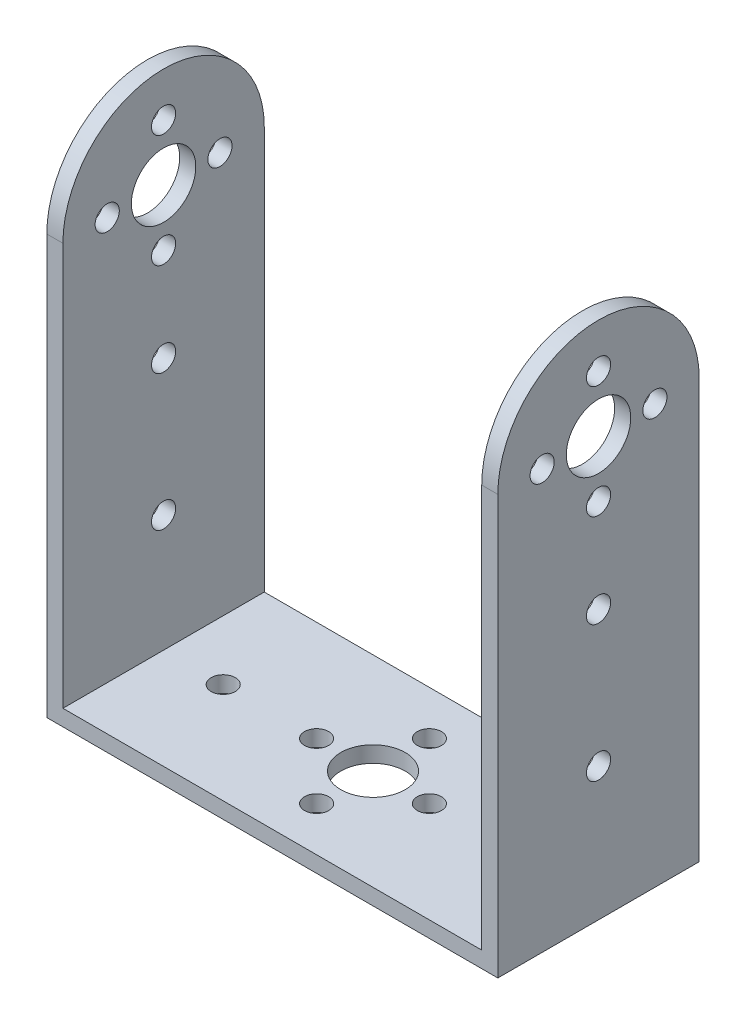
ISO-10303-21;
HEADER;
FILE_DESCRIPTION(('STEP AP214'),'2;1');
FILE_NAME('part.step','',(''),(''),'','','');
FILE_SCHEMA(('AUTOMOTIVE_DESIGN { 1 0 10303 214 1 1 1 1 }'));
ENDSEC;
DATA;
#1=APPLICATION_CONTEXT('core data for automotive mechanical design processes');
#2=APPLICATION_PROTOCOL_DEFINITION('international standard','automotive_design',2000,#1);
#3=PRODUCT_CONTEXT('',#1,'mechanical');
#4=PRODUCT('Part','Part','',(#3));
#5=PRODUCT_RELATED_PRODUCT_CATEGORY('part','',(#4));
#6=PRODUCT_DEFINITION_FORMATION('','',#4);
#7=PRODUCT_DEFINITION_CONTEXT('part definition',#1,'design');
#8=PRODUCT_DEFINITION('design','',#6,#7);
#9=PRODUCT_DEFINITION_SHAPE('','',#8);
#10=(LENGTH_UNIT() NAMED_UNIT(*) SI_UNIT(.MILLI.,.METRE.));
#11=(NAMED_UNIT(*) PLANE_ANGLE_UNIT() SI_UNIT($,.RADIAN.));
#12=(NAMED_UNIT(*) SI_UNIT($,.STERADIAN.) SOLID_ANGLE_UNIT());
#13=UNCERTAINTY_MEASURE_WITH_UNIT(LENGTH_MEASURE(1.E-05),#10,'distance_accuracy_value','');
#14=(GEOMETRIC_REPRESENTATION_CONTEXT(3) GLOBAL_UNCERTAINTY_ASSIGNED_CONTEXT((#13)) GLOBAL_UNIT_ASSIGNED_CONTEXT((#10,
#11,#12)) REPRESENTATION_CONTEXT('',''));
#15=CARTESIAN_POINT('',(0.,0.,0.));
#16=DIRECTION('',(0.,0.,1.));
#17=DIRECTION('',(1.,0.,0.));
#18=AXIS2_PLACEMENT_3D('',#15,#16,#17);
#19=CARTESIAN_POINT('',(0.,2.,0.));
#20=DIRECTION('',(0.,1.,0.));
#21=DIRECTION('',(0.,0.,1.));
#22=AXIS2_PLACEMENT_3D('',#19,#20,#21);
#23=PLANE('',#22);
#24=CARTESIAN_POINT('',(26.2542553191489,2.,-0.73138297872341));
#25=DIRECTION('',(0.,1.,0.));
#26=DIRECTION('',(0.,0.,1.));
#27=AXIS2_PLACEMENT_3D('',#24,#25,#26);
#28=CIRCLE('',#27,1.5);
#29=CARTESIAN_POINT('',(26.2542553191489,2.,0.768617021276591));
#30=VERTEX_POINT('',#29);
#31=EDGE_CURVE('E194',#30,#30,#28,.T.);
#32=ORIENTED_EDGE('',*,*,#31,.F.);
#33=EDGE_LOOP('',(#32));
#34=FACE_BOUND('',#33,.T.);
#35=CARTESIAN_POINT('',(0.654255319149036,2.,-0.731382978723379));
#36=DIRECTION('',(0.,1.,0.));
#37=DIRECTION('',(0.,0.,1.));
#38=AXIS2_PLACEMENT_3D('',#35,#36,#37);
#39=CIRCLE('',#38,1.5);
#40=CARTESIAN_POINT('',(0.654255319149036,2.,0.768617021276619));
#41=VERTEX_POINT('',#40);
#42=EDGE_CURVE('E207',#41,#41,#39,.T.);
#43=ORIENTED_EDGE('',*,*,#42,.F.);
#44=EDGE_LOOP('',(#43));
#45=FACE_BOUND('',#44,.T.);
#46=CARTESIAN_POINT('',(7.65425531914909,2.,6.2686170212766));
#47=DIRECTION('',(0.,1.,0.));
#48=DIRECTION('',(0.,0.,1.));
#49=AXIS2_PLACEMENT_3D('',#46,#47,#48);
#50=CIRCLE('',#49,1.5);
#51=CARTESIAN_POINT('',(7.65425531914909,2.,7.7686170212766));
#52=VERTEX_POINT('',#51);
#53=EDGE_CURVE('E201',#52,#52,#50,.T.);
#54=ORIENTED_EDGE('',*,*,#53,.F.);
#55=EDGE_LOOP('',(#54));
#56=FACE_BOUND('',#55,.T.);
#57=CARTESIAN_POINT('',(14.654255319149,2.,-0.731382978723479));
#58=DIRECTION('',(0.,1.,0.));
#59=DIRECTION('',(0.,0.,1.));
#60=AXIS2_PLACEMENT_3D('',#57,#58,#59);
#61=CIRCLE('',#60,1.5);
#62=CARTESIAN_POINT('',(14.654255319149,2.,0.768617021276519));
#63=VERTEX_POINT('',#62);
#64=EDGE_CURVE('E200',#63,#63,#61,.T.);
#65=ORIENTED_EDGE('',*,*,#64,.F.);
#66=EDGE_LOOP('',(#65));
#67=FACE_BOUND('',#66,.T.);
#68=CARTESIAN_POINT('',(-10.9457446808511,2.,-0.731382978723405));
#69=DIRECTION('',(0.,1.,0.));
#70=DIRECTION('',(0.,0.,1.));
#71=AXIS2_PLACEMENT_3D('',#68,#69,#70);
#72=CIRCLE('',#71,1.5);
#73=CARTESIAN_POINT('',(-10.9457446808511,2.,0.768617021276595));
#74=VERTEX_POINT('',#73);
#75=EDGE_CURVE('E225',#74,#74,#72,.T.);
#76=ORIENTED_EDGE('',*,*,#75,.F.);
#77=EDGE_LOOP('',(#76));
#78=FACE_BOUND('',#77,.T.);
#79=CARTESIAN_POINT('',(7.65425531914894,2.,-7.73138297872341));
#80=DIRECTION('',(0.,1.,0.));
#81=DIRECTION('',(0.,0.,1.));
#82=AXIS2_PLACEMENT_3D('',#79,#80,#81);
#83=CIRCLE('',#82,1.5);
#84=CARTESIAN_POINT('',(7.65425531914894,2.,-6.23138297872341));
#85=VERTEX_POINT('',#84);
#86=EDGE_CURVE('E219',#85,#85,#83,.T.);
#87=ORIENTED_EDGE('',*,*,#86,.F.);
#88=EDGE_LOOP('',(#87));
#89=FACE_BOUND('',#88,.T.);
#90=CARTESIAN_POINT('',(7.65425531914894,2.,-0.731382978723405));
#91=DIRECTION('',(0.,1.,0.));
#92=DIRECTION('',(0.,0.,1.));
#93=AXIS2_PLACEMENT_3D('',#90,#91,#92);
#94=CIRCLE('',#93,4.);
#95=CARTESIAN_POINT('',(7.65425531914894,2.,3.2686170212766));
#96=VERTEX_POINT('',#95);
#97=EDGE_CURVE('E218',#96,#96,#94,.T.);
#98=ORIENTED_EDGE('',*,*,#97,.F.);
#99=EDGE_LOOP('',(#98));
#100=FACE_BOUND('',#99,.T.);
#101=DIRECTION('',(1.,0.,0.));
#102=VECTOR('',#101,1.);
#103=CARTESIAN_POINT('',(-20.3457446808511,2.,11.7686170212766));
#104=LINE('',#103,#102);
#105=CARTESIAN_POINT('',(-18.3457446808511,2.,11.7686170212766));
#106=VERTEX_POINT('',#105);
#107=CARTESIAN_POINT('',(33.6542553191489,2.,11.7686170212766));
#108=VERTEX_POINT('',#107);
#109=EDGE_CURVE('E50',#106,#108,#104,.T.);
#110=ORIENTED_EDGE('',*,*,#109,.T.);
#111=DIRECTION('',(0.,0.,1.));
#112=VECTOR('',#111,1.);
#113=CARTESIAN_POINT('',(33.6542553191489,2.,-13.2313829787234));
#114=LINE('',#113,#112);
#115=CARTESIAN_POINT('',(33.6542553191489,2.,-13.2313829787234));
#116=VERTEX_POINT('',#115);
#117=EDGE_CURVE('E122',#116,#108,#114,.T.);
#118=ORIENTED_EDGE('',*,*,#117,.F.);
#119=DIRECTION('',(-1.,0.,0.));
#120=VECTOR('',#119,1.);
#121=CARTESIAN_POINT('',(-20.3457446808511,2.,-13.2313829787234));
#122=LINE('',#121,#120);
#123=CARTESIAN_POINT('',(-18.3457446808511,2.,-13.2313829787234));
#124=VERTEX_POINT('',#123);
#125=EDGE_CURVE('E126',#116,#124,#122,.T.);
#126=ORIENTED_EDGE('',*,*,#125,.T.);
#127=DIRECTION('',(0.,0.,1.));
#128=VECTOR('',#127,1.);
#129=CARTESIAN_POINT('',(-18.3457446808511,2.,-13.2313829787234));
#130=LINE('',#129,#128);
#131=EDGE_CURVE('E182',#124,#106,#130,.T.);
#132=ORIENTED_EDGE('',*,*,#131,.T.);
#133=EDGE_LOOP('',(#110,#118,#126,#132));
#134=FACE_BOUND('',#133,.T.);
#135=ADVANCED_FACE('F35',(#34,#45,#56,#67,#78,#89,#100,#134),#23,.T.);
#136=CARTESIAN_POINT('',(-20.3457446808511,2.,-13.2313829787234));
#137=DIRECTION('',(1.,0.,0.));
#138=DIRECTION('',(0.,0.,-1.));
#139=AXIS2_PLACEMENT_3D('',#136,#137,#138);
#140=PLANE('',#139);
#141=CARTESIAN_POINT('',(-20.3457446808511,45.,-0.731382978723404));
#142=DIRECTION('',(-1.,0.,0.));
#143=DIRECTION('',(0.,0.,1.));
#144=AXIS2_PLACEMENT_3D('',#141,#142,#143);
#145=CIRCLE('',#144,1.5);
#146=CARTESIAN_POINT('',(-20.3457446808511,45.,0.768617021276594));
#147=VERTEX_POINT('',#146);
#148=EDGE_CURVE('E145',#147,#147,#145,.T.);
#149=ORIENTED_EDGE('',*,*,#148,.F.);
#150=EDGE_LOOP('',(#149));
#151=FACE_BOUND('',#150,.T.);
#152=CARTESIAN_POINT('',(-20.3457446808511,52.,-7.7313829787234));
#153=DIRECTION('',(-1.,0.,0.));
#154=DIRECTION('',(0.,0.,1.));
#155=AXIS2_PLACEMENT_3D('',#152,#153,#154);
#156=CIRCLE('',#155,1.5);
#157=CARTESIAN_POINT('',(-20.3457446808511,52.,-6.2313829787234));
#158=VERTEX_POINT('',#157);
#159=EDGE_CURVE('E138',#158,#158,#156,.T.);
#160=ORIENTED_EDGE('',*,*,#159,.F.);
#161=EDGE_LOOP('',(#160));
#162=FACE_BOUND('',#161,.T.);
#163=CARTESIAN_POINT('',(-20.3457446808511,16.53,-0.731382978723405));
#164=DIRECTION('',(-1.,0.,0.));
#165=DIRECTION('',(0.,0.,1.));
#166=AXIS2_PLACEMENT_3D('',#163,#164,#165);
#167=CIRCLE('',#166,1.5);
#168=CARTESIAN_POINT('',(-20.3457446808511,16.53,0.768617021276596));
#169=VERTEX_POINT('',#168);
#170=EDGE_CURVE('E136',#169,#169,#167,.T.);
#171=ORIENTED_EDGE('',*,*,#170,.F.);
#172=EDGE_LOOP('',(#171));
#173=FACE_BOUND('',#172,.T.);
#174=CARTESIAN_POINT('',(-20.3457446808511,52.,-0.731382978723405));
#175=DIRECTION('',(-1.,0.,0.));
#176=DIRECTION('',(0.,0.,1.));
#177=AXIS2_PLACEMENT_3D('',#174,#175,#176);
#178=CIRCLE('',#177,4.);
#179=CARTESIAN_POINT('',(-20.3457446808511,52.,3.2686170212766));
#180=VERTEX_POINT('',#179);
#181=EDGE_CURVE('E163',#180,#180,#178,.T.);
#182=ORIENTED_EDGE('',*,*,#181,.F.);
#183=EDGE_LOOP('',(#182));
#184=FACE_BOUND('',#183,.T.);
#185=CARTESIAN_POINT('',(-20.3457446808511,59.,-0.731382978723405));
#186=DIRECTION('',(-1.,0.,0.));
#187=DIRECTION('',(0.,0.,1.));
#188=AXIS2_PLACEMENT_3D('',#185,#186,#187);
#189=CIRCLE('',#188,1.5);
#190=CARTESIAN_POINT('',(-20.3457446808511,59.,0.768617021276596));
#191=VERTEX_POINT('',#190);
#192=EDGE_CURVE('E156',#191,#191,#189,.T.);
#193=ORIENTED_EDGE('',*,*,#192,.F.);
#194=EDGE_LOOP('',(#193));
#195=FACE_BOUND('',#194,.T.);
#196=CARTESIAN_POINT('',(-20.3457446808511,52.,6.26861702127659));
#197=DIRECTION('',(-1.,0.,0.));
#198=DIRECTION('',(0.,0.,1.));
#199=AXIS2_PLACEMENT_3D('',#196,#197,#198);
#200=CIRCLE('',#199,1.5);
#201=CARTESIAN_POINT('',(-20.3457446808511,52.,7.7686170212766));
#202=VERTEX_POINT('',#201);
#203=EDGE_CURVE('E155',#202,#202,#200,.T.);
#204=ORIENTED_EDGE('',*,*,#203,.F.);
#205=EDGE_LOOP('',(#204));
#206=FACE_BOUND('',#205,.T.);
#207=CARTESIAN_POINT('',(-20.3457446808511,33.4,-0.731382978723405));
#208=DIRECTION('',(-1.,0.,0.));
#209=DIRECTION('',(0.,0.,1.));
#210=AXIS2_PLACEMENT_3D('',#207,#208,#209);
#211=CIRCLE('',#210,1.5);
#212=CARTESIAN_POINT('',(-20.3457446808511,33.4,0.768617021276596));
#213=VERTEX_POINT('',#212);
#214=EDGE_CURVE('E173',#213,#213,#211,.T.);
#215=ORIENTED_EDGE('',*,*,#214,.F.);
#216=EDGE_LOOP('',(#215));
#217=FACE_BOUND('',#216,.T.);
#218=DIRECTION('',(0.,0.,1.));
#219=VECTOR('',#218,1.);
#220=CARTESIAN_POINT('',(-20.3457446808511,0.,-13.2313829787234));
#221=LINE('',#220,#219);
#222=CARTESIAN_POINT('',(-20.3457446808511,0.,-13.2313829787234));
#223=VERTEX_POINT('',#222);
#224=CARTESIAN_POINT('',(-20.3457446808511,0.,11.7686170212766));
#225=VERTEX_POINT('',#224);
#226=EDGE_CURVE('E236',#223,#225,#221,.T.);
#227=ORIENTED_EDGE('',*,*,#226,.T.);
#228=DIRECTION('',(0.,-1.,0.));
#229=VECTOR('',#228,1.);
#230=CARTESIAN_POINT('',(-20.3457446808511,2.,11.7686170212766));
#231=LINE('',#230,#229);
#232=CARTESIAN_POINT('',(-20.3457446808511,52.,11.7686170212766));
#233=VERTEX_POINT('',#232);
#234=EDGE_CURVE('E11',#233,#225,#231,.T.);
#235=ORIENTED_EDGE('',*,*,#234,.F.);
#236=CARTESIAN_POINT('',(-20.3457446808511,52.,-0.731382978723405));
#237=DIRECTION('',(-1.,0.,0.));
#238=DIRECTION('',(0.,0.,1.));
#239=AXIS2_PLACEMENT_3D('',#236,#237,#238);
#240=CIRCLE('',#239,12.5);
#241=CARTESIAN_POINT('',(-20.3457446808511,52.,-13.2313829787234));
#242=VERTEX_POINT('',#241);
#243=EDGE_CURVE('E179',#233,#242,#240,.T.);
#244=ORIENTED_EDGE('',*,*,#243,.T.);
#245=DIRECTION('',(0.,-1.,0.));
#246=VECTOR('',#245,1.);
#247=CARTESIAN_POINT('',(-20.3457446808511,2.,-13.2313829787234));
#248=LINE('',#247,#246);
#249=EDGE_CURVE('E242',#242,#223,#248,.T.);
#250=ORIENTED_EDGE('',*,*,#249,.T.);
#251=EDGE_LOOP('',(#227,#235,#244,#250));
#252=FACE_BOUND('',#251,.T.);
#253=ADVANCED_FACE('F37',(#151,#162,#173,#184,#195,#206,#217,#252),#140,.F.);
#254=CARTESIAN_POINT('',(-20.3457446808511,2.,11.7686170212766));
#255=DIRECTION('',(0.,0.,-1.));
#256=DIRECTION('',(-1.,0.,0.));
#257=AXIS2_PLACEMENT_3D('',#254,#255,#256);
#258=PLANE('',#257);
#259=DIRECTION('',(1.,0.,0.));
#260=VECTOR('',#259,1.);
#261=CARTESIAN_POINT('',(-20.3457446808511,0.,11.7686170212766));
#262=LINE('',#261,#260);
#263=CARTESIAN_POINT('',(35.6542553191489,0.,11.7686170212766));
#264=VERTEX_POINT('',#263);
#265=EDGE_CURVE('E245',#225,#264,#262,.T.);
#266=ORIENTED_EDGE('',*,*,#265,.T.);
#267=DIRECTION('',(0.,-1.,0.));
#268=VECTOR('',#267,1.);
#269=CARTESIAN_POINT('',(35.6542553191489,2.,11.7686170212766));
#270=LINE('',#269,#268);
#271=CARTESIAN_POINT('',(35.6542553191489,52.,11.7686170212766));
#272=VERTEX_POINT('',#271);
#273=EDGE_CURVE('E43',#272,#264,#270,.T.);
#274=ORIENTED_EDGE('',*,*,#273,.F.);
#275=DIRECTION('',(1.,0.,0.));
#276=VECTOR('',#275,1.);
#277=CARTESIAN_POINT('',(33.6542553191489,52.,11.7686170212766));
#278=LINE('',#277,#276);
#279=CARTESIAN_POINT('',(33.6542553191489,52.,11.7686170212766));
#280=VERTEX_POINT('',#279);
#281=EDGE_CURVE('E121',#280,#272,#278,.T.);
#282=ORIENTED_EDGE('',*,*,#281,.F.);
#283=DIRECTION('',(0.,1.,0.));
#284=VECTOR('',#283,1.);
#285=CARTESIAN_POINT('',(33.6542553191489,22.,11.7686170212766));
#286=LINE('',#285,#284);
#287=EDGE_CURVE('E108',#108,#280,#286,.T.);
#288=ORIENTED_EDGE('',*,*,#287,.F.);
#289=ORIENTED_EDGE('',*,*,#109,.F.);
#290=DIRECTION('',(0.,1.,0.));
#291=VECTOR('',#290,1.);
#292=CARTESIAN_POINT('',(-18.3457446808511,2.,11.7686170212766));
#293=LINE('',#292,#291);
#294=CARTESIAN_POINT('',(-18.3457446808511,52.,11.7686170212766));
#295=VERTEX_POINT('',#294);
#296=EDGE_CURVE('E58',#106,#295,#293,.T.);
#297=ORIENTED_EDGE('',*,*,#296,.T.);
#298=DIRECTION('',(-1.,0.,0.));
#299=VECTOR('',#298,1.);
#300=CARTESIAN_POINT('',(-18.3457446808511,52.,11.7686170212766));
#301=LINE('',#300,#299);
#302=EDGE_CURVE('E188',#295,#233,#301,.T.);
#303=ORIENTED_EDGE('',*,*,#302,.T.);
#304=ORIENTED_EDGE('',*,*,#234,.T.);
#305=EDGE_LOOP('',(#266,#274,#282,#288,#289,#297,#303,#304));
#306=FACE_BOUND('',#305,.T.);
#307=ADVANCED_FACE('F269',(#306),#258,.F.);
#308=CARTESIAN_POINT('',(35.6542553191489,2.,-13.2313829787234));
#309=DIRECTION('',(-1.,0.,0.));
#310=DIRECTION('',(0.,0.,1.));
#311=AXIS2_PLACEMENT_3D('',#308,#309,#310);
#312=PLANE('',#311);
#313=CARTESIAN_POINT('',(35.6542553191489,45.,-0.731382978723404));
#314=DIRECTION('',(-1.,0.,0.));
#315=DIRECTION('',(0.,0.,1.));
#316=AXIS2_PLACEMENT_3D('',#313,#314,#315);
#317=CIRCLE('',#316,1.5);
#318=CARTESIAN_POINT('',(35.6542553191489,45.,0.768617021276594));
#319=VERTEX_POINT('',#318);
#320=EDGE_CURVE('E599',#319,#319,#317,.T.);
#321=ORIENTED_EDGE('',*,*,#320,.T.);
#322=EDGE_LOOP('',(#321));
#323=FACE_BOUND('',#322,.T.);
#324=CARTESIAN_POINT('',(35.6542553191489,52.,-7.7313829787234));
#325=DIRECTION('',(-1.,0.,0.));
#326=DIRECTION('',(0.,0.,1.));
#327=AXIS2_PLACEMENT_3D('',#324,#325,#326);
#328=CIRCLE('',#327,1.5);
#329=CARTESIAN_POINT('',(35.6542553191489,52.,-6.2313829787234));
#330=VERTEX_POINT('',#329);
#331=EDGE_CURVE('E603',#330,#330,#328,.T.);
#332=ORIENTED_EDGE('',*,*,#331,.T.);
#333=EDGE_LOOP('',(#332));
#334=FACE_BOUND('',#333,.T.);
#335=CARTESIAN_POINT('',(35.6542553191489,16.53,-0.731382978723405));
#336=DIRECTION('',(-1.,0.,0.));
#337=DIRECTION('',(0.,0.,1.));
#338=AXIS2_PLACEMENT_3D('',#335,#336,#337);
#339=CIRCLE('',#338,1.5);
#340=CARTESIAN_POINT('',(35.6542553191489,16.53,0.768617021276596));
#341=VERTEX_POINT('',#340);
#342=EDGE_CURVE('E653',#341,#341,#339,.T.);
#343=ORIENTED_EDGE('',*,*,#342,.T.);
#344=EDGE_LOOP('',(#343));
#345=FACE_BOUND('',#344,.T.);
#346=CARTESIAN_POINT('',(35.6542553191489,52.,-0.731382978723405));
#347=DIRECTION('',(-1.,0.,0.));
#348=DIRECTION('',(0.,0.,1.));
#349=AXIS2_PLACEMENT_3D('',#346,#347,#348);
#350=CIRCLE('',#349,4.);
#351=CARTESIAN_POINT('',(35.6542553191489,52.,3.2686170212766));
#352=VERTEX_POINT('',#351);
#353=EDGE_CURVE('E624',#352,#352,#350,.T.);
#354=ORIENTED_EDGE('',*,*,#353,.T.);
#355=EDGE_LOOP('',(#354));
#356=FACE_BOUND('',#355,.T.);
#357=CARTESIAN_POINT('',(35.6542553191489,59.,-0.731382978723405));
#358=DIRECTION('',(-1.,0.,0.));
#359=DIRECTION('',(0.,0.,1.));
#360=AXIS2_PLACEMENT_3D('',#357,#358,#359);
#361=CIRCLE('',#360,1.5);
#362=CARTESIAN_POINT('',(35.6542553191489,59.,0.768617021276596));
#363=VERTEX_POINT('',#362);
#364=EDGE_CURVE('E612',#363,#363,#361,.T.);
#365=ORIENTED_EDGE('',*,*,#364,.T.);
#366=EDGE_LOOP('',(#365));
#367=FACE_BOUND('',#366,.T.);
#368=CARTESIAN_POINT('',(35.6542553191489,52.,6.26861702127659));
#369=DIRECTION('',(-1.,0.,0.));
#370=DIRECTION('',(0.,0.,1.));
#371=AXIS2_PLACEMENT_3D('',#368,#369,#370);
#372=CIRCLE('',#371,1.5);
#373=CARTESIAN_POINT('',(35.6542553191489,52.,7.7686170212766));
#374=VERTEX_POINT('',#373);
#375=EDGE_CURVE('E619',#374,#374,#372,.T.);
#376=ORIENTED_EDGE('',*,*,#375,.T.);
#377=EDGE_LOOP('',(#376));
#378=FACE_BOUND('',#377,.T.);
#379=CARTESIAN_POINT('',(35.6542553191489,33.4,-0.731382978723405));
#380=DIRECTION('',(-1.,0.,0.));
#381=DIRECTION('',(0.,0.,1.));
#382=AXIS2_PLACEMENT_3D('',#379,#380,#381);
#383=CIRCLE('',#382,1.5);
#384=CARTESIAN_POINT('',(35.6542553191489,33.4,0.768617021276596));
#385=VERTEX_POINT('',#384);
#386=EDGE_CURVE('E128',#385,#385,#383,.T.);
#387=ORIENTED_EDGE('',*,*,#386,.T.);
#388=EDGE_LOOP('',(#387));
#389=FACE_BOUND('',#388,.T.);
#390=DIRECTION('',(0.,0.,-1.));
#391=VECTOR('',#390,1.);
#392=CARTESIAN_POINT('',(35.6542553191489,0.,-13.2313829787234));
#393=LINE('',#392,#391);
#394=CARTESIAN_POINT('',(35.6542553191489,0.,-13.2313829787234));
#395=VERTEX_POINT('',#394);
#396=EDGE_CURVE('E247',#264,#395,#393,.T.);
#397=ORIENTED_EDGE('',*,*,#396,.T.);
#398=DIRECTION('',(0.,-1.,0.));
#399=VECTOR('',#398,1.);
#400=CARTESIAN_POINT('',(35.6542553191489,2.,-13.2313829787234));
#401=LINE('',#400,#399);
#402=CARTESIAN_POINT('',(35.6542553191489,52.,-13.2313829787234));
#403=VERTEX_POINT('',#402);
#404=EDGE_CURVE('E252',#403,#395,#401,.T.);
#405=ORIENTED_EDGE('',*,*,#404,.F.);
#406=CARTESIAN_POINT('',(35.6542553191489,52.,-0.731382978723405));
#407=DIRECTION('',(-1.,0.,0.));
#408=DIRECTION('',(0.,0.,1.));
#409=AXIS2_PLACEMENT_3D('',#406,#407,#408);
#410=CIRCLE('',#409,12.5);
#411=EDGE_CURVE('E118',#272,#403,#410,.T.);
#412=ORIENTED_EDGE('',*,*,#411,.F.);
#413=ORIENTED_EDGE('',*,*,#273,.T.);
#414=EDGE_LOOP('',(#397,#405,#412,#413));
#415=FACE_BOUND('',#414,.T.);
#416=ADVANCED_FACE('F256',(#323,#334,#345,#356,#367,#378,#389,#415),#312,.F.);
#417=CARTESIAN_POINT('',(-20.3457446808511,2.,-13.2313829787234));
#418=DIRECTION('',(0.,0.,1.));
#419=DIRECTION('',(1.,0.,0.));
#420=AXIS2_PLACEMENT_3D('',#417,#418,#419);
#421=PLANE('',#420);
#422=DIRECTION('',(-1.,0.,0.));
#423=VECTOR('',#422,1.);
#424=CARTESIAN_POINT('',(-20.3457446808511,0.,-13.2313829787234));
#425=LINE('',#424,#423);
#426=EDGE_CURVE('E240',#395,#223,#425,.T.);
#427=ORIENTED_EDGE('',*,*,#426,.T.);
#428=ORIENTED_EDGE('',*,*,#249,.F.);
#429=DIRECTION('',(-1.,0.,0.));
#430=VECTOR('',#429,1.);
#431=CARTESIAN_POINT('',(-18.3457446808511,52.,-13.2313829787234));
#432=LINE('',#431,#430);
#433=CARTESIAN_POINT('',(-18.3457446808511,52.,-13.2313829787234));
#434=VERTEX_POINT('',#433);
#435=EDGE_CURVE('E191',#434,#242,#432,.T.);
#436=ORIENTED_EDGE('',*,*,#435,.F.);
#437=DIRECTION('',(0.,-1.,0.));
#438=VECTOR('',#437,1.);
#439=CARTESIAN_POINT('',(-18.3457446808511,22.,-13.2313829787234));
#440=LINE('',#439,#438);
#441=EDGE_CURVE('E180',#434,#124,#440,.T.);
#442=ORIENTED_EDGE('',*,*,#441,.T.);
#443=ORIENTED_EDGE('',*,*,#125,.F.);
#444=DIRECTION('',(0.,-1.,0.));
#445=VECTOR('',#444,1.);
#446=CARTESIAN_POINT('',(33.6542553191489,22.,-13.2313829787234));
#447=LINE('',#446,#445);
#448=CARTESIAN_POINT('',(33.6542553191489,52.,-13.2313829787234));
#449=VERTEX_POINT('',#448);
#450=EDGE_CURVE('E107',#449,#116,#447,.T.);
#451=ORIENTED_EDGE('',*,*,#450,.F.);
#452=DIRECTION('',(1.,0.,0.));
#453=VECTOR('',#452,1.);
#454=CARTESIAN_POINT('',(33.6542553191489,52.,-13.2313829787234));
#455=LINE('',#454,#453);
#456=EDGE_CURVE('E115',#449,#403,#455,.T.);
#457=ORIENTED_EDGE('',*,*,#456,.T.);
#458=ORIENTED_EDGE('',*,*,#404,.T.);
#459=EDGE_LOOP('',(#427,#428,#436,#442,#443,#451,#457,#458));
#460=FACE_BOUND('',#459,.T.);
#461=ADVANCED_FACE('F124',(#460),#421,.F.);
#462=CARTESIAN_POINT('',(0.,0.,0.));
#463=DIRECTION('',(0.,1.,0.));
#464=DIRECTION('',(0.,0.,1.));
#465=AXIS2_PLACEMENT_3D('',#462,#463,#464);
#466=PLANE('',#465);
#467=CARTESIAN_POINT('',(26.2542553191489,0.,-0.73138297872341));
#468=DIRECTION('',(0.,1.,0.));
#469=DIRECTION('',(0.,0.,1.));
#470=AXIS2_PLACEMENT_3D('',#467,#468,#469);
#471=CIRCLE('',#470,1.5);
#472=CARTESIAN_POINT('',(26.2542553191489,0.,0.768617021276591));
#473=VERTEX_POINT('',#472);
#474=EDGE_CURVE('E210',#473,#473,#471,.T.);
#475=ORIENTED_EDGE('',*,*,#474,.T.);
#476=EDGE_LOOP('',(#475));
#477=FACE_BOUND('',#476,.T.);
#478=CARTESIAN_POINT('',(0.654255319149036,0.,-0.731382978723379));
#479=DIRECTION('',(0.,1.,0.));
#480=DIRECTION('',(0.,0.,1.));
#481=AXIS2_PLACEMENT_3D('',#478,#479,#480);
#482=CIRCLE('',#481,1.5);
#483=CARTESIAN_POINT('',(0.654255319149036,0.,0.768617021276619));
#484=VERTEX_POINT('',#483);
#485=EDGE_CURVE('E204',#484,#484,#482,.T.);
#486=ORIENTED_EDGE('',*,*,#485,.T.);
#487=EDGE_LOOP('',(#486));
#488=FACE_BOUND('',#487,.T.);
#489=CARTESIAN_POINT('',(7.65425531914909,0.,6.2686170212766));
#490=DIRECTION('',(0.,1.,0.));
#491=DIRECTION('',(0.,0.,1.));
#492=AXIS2_PLACEMENT_3D('',#489,#490,#491);
#493=CIRCLE('',#492,1.5);
#494=CARTESIAN_POINT('',(7.65425531914909,0.,7.7686170212766));
#495=VERTEX_POINT('',#494);
#496=EDGE_CURVE('E197',#495,#495,#493,.T.);
#497=ORIENTED_EDGE('',*,*,#496,.T.);
#498=EDGE_LOOP('',(#497));
#499=FACE_BOUND('',#498,.T.);
#500=CARTESIAN_POINT('',(14.654255319149,0.,-0.731382978723479));
#501=DIRECTION('',(0.,1.,0.));
#502=DIRECTION('',(0.,0.,1.));
#503=AXIS2_PLACEMENT_3D('',#500,#501,#502);
#504=CIRCLE('',#503,1.5);
#505=CARTESIAN_POINT('',(14.654255319149,0.,0.768617021276519));
#506=VERTEX_POINT('',#505);
#507=EDGE_CURVE('E228',#506,#506,#504,.T.);
#508=ORIENTED_EDGE('',*,*,#507,.T.);
#509=EDGE_LOOP('',(#508));
#510=FACE_BOUND('',#509,.T.);
#511=CARTESIAN_POINT('',(-10.9457446808511,0.,-0.731382978723405));
#512=DIRECTION('',(0.,1.,0.));
#513=DIRECTION('',(0.,0.,1.));
#514=AXIS2_PLACEMENT_3D('',#511,#512,#513);
#515=CIRCLE('',#514,1.5);
#516=CARTESIAN_POINT('',(-10.9457446808511,0.,0.768617021276595));
#517=VERTEX_POINT('',#516);
#518=EDGE_CURVE('E222',#517,#517,#515,.T.);
#519=ORIENTED_EDGE('',*,*,#518,.T.);
#520=EDGE_LOOP('',(#519));
#521=FACE_BOUND('',#520,.T.);
#522=CARTESIAN_POINT('',(7.65425531914894,0.,-7.73138297872341));
#523=DIRECTION('',(0.,1.,0.));
#524=DIRECTION('',(0.,0.,1.));
#525=AXIS2_PLACEMENT_3D('',#522,#523,#524);
#526=CIRCLE('',#525,1.5);
#527=CARTESIAN_POINT('',(7.65425531914894,0.,-6.23138297872341));
#528=VERTEX_POINT('',#527);
#529=EDGE_CURVE('E215',#528,#528,#526,.T.);
#530=ORIENTED_EDGE('',*,*,#529,.T.);
#531=EDGE_LOOP('',(#530));
#532=FACE_BOUND('',#531,.T.);
#533=CARTESIAN_POINT('',(7.65425531914894,0.,-0.731382978723405));
#534=DIRECTION('',(0.,1.,0.));
#535=DIRECTION('',(0.,0.,1.));
#536=AXIS2_PLACEMENT_3D('',#533,#534,#535);
#537=CIRCLE('',#536,4.);
#538=CARTESIAN_POINT('',(7.65425531914894,0.,3.2686170212766));
#539=VERTEX_POINT('',#538);
#540=EDGE_CURVE('E233',#539,#539,#537,.T.);
#541=ORIENTED_EDGE('',*,*,#540,.T.);
#542=EDGE_LOOP('',(#541));
#543=FACE_BOUND('',#542,.T.);
#544=ORIENTED_EDGE('',*,*,#226,.F.);
#545=ORIENTED_EDGE('',*,*,#426,.F.);
#546=ORIENTED_EDGE('',*,*,#396,.F.);
#547=ORIENTED_EDGE('',*,*,#265,.F.);
#548=EDGE_LOOP('',(#544,#545,#546,#547));
#549=FACE_BOUND('',#548,.T.);
#550=ADVANCED_FACE('F261',(#477,#488,#499,#510,#521,#532,#543,#549),#466,.F.);
#551=CARTESIAN_POINT('',(7.65425531914894,0.,-0.731382978723405));
#552=DIRECTION('',(0.,1.,0.));
#553=DIRECTION('',(0.,0.,1.));
#554=AXIS2_PLACEMENT_3D('',#551,#552,#553);
#555=CYLINDRICAL_SURFACE('',#554,4.);
#556=ORIENTED_EDGE('',*,*,#540,.F.);
#557=EDGE_LOOP('',(#556));
#558=FACE_BOUND('',#557,.T.);
#559=ORIENTED_EDGE('',*,*,#97,.T.);
#560=EDGE_LOOP('',(#559));
#561=FACE_BOUND('',#560,.T.);
#562=ADVANCED_FACE('F287',(#558,#561),#555,.F.);
#563=CARTESIAN_POINT('',(7.65425531914894,0.,-7.73138297872341));
#564=DIRECTION('',(0.,1.,0.));
#565=DIRECTION('',(0.,0.,1.));
#566=AXIS2_PLACEMENT_3D('',#563,#564,#565);
#567=CYLINDRICAL_SURFACE('',#566,1.5);
#568=ORIENTED_EDGE('',*,*,#529,.F.);
#569=EDGE_LOOP('',(#568));
#570=FACE_BOUND('',#569,.T.);
#571=ORIENTED_EDGE('',*,*,#86,.T.);
#572=EDGE_LOOP('',(#571));
#573=FACE_BOUND('',#572,.T.);
#574=ADVANCED_FACE('F308',(#570,#573),#567,.F.);
#575=CARTESIAN_POINT('',(-10.9457446808511,0.,-0.731382978723405));
#576=DIRECTION('',(0.,1.,0.));
#577=DIRECTION('',(0.,0.,1.));
#578=AXIS2_PLACEMENT_3D('',#575,#576,#577);
#579=CYLINDRICAL_SURFACE('',#578,1.5);
#580=ORIENTED_EDGE('',*,*,#518,.F.);
#581=EDGE_LOOP('',(#580));
#582=FACE_BOUND('',#581,.T.);
#583=ORIENTED_EDGE('',*,*,#75,.T.);
#584=EDGE_LOOP('',(#583));
#585=FACE_BOUND('',#584,.T.);
#586=ADVANCED_FACE('F315',(#582,#585),#579,.F.);
#587=CARTESIAN_POINT('',(14.654255319149,0.,-0.731382978723479));
#588=DIRECTION('',(0.,1.,0.));
#589=DIRECTION('',(0.,0.,1.));
#590=AXIS2_PLACEMENT_3D('',#587,#588,#589);
#591=CYLINDRICAL_SURFACE('',#590,1.5);
#592=ORIENTED_EDGE('',*,*,#507,.F.);
#593=EDGE_LOOP('',(#592));
#594=FACE_BOUND('',#593,.T.);
#595=ORIENTED_EDGE('',*,*,#64,.T.);
#596=EDGE_LOOP('',(#595));
#597=FACE_BOUND('',#596,.T.);
#598=ADVANCED_FACE('F323',(#594,#597),#591,.F.);
#599=CARTESIAN_POINT('',(7.65425531914909,0.,6.2686170212766));
#600=DIRECTION('',(0.,1.,0.));
#601=DIRECTION('',(0.,0.,1.));
#602=AXIS2_PLACEMENT_3D('',#599,#600,#601);
#603=CYLINDRICAL_SURFACE('',#602,1.5);
#604=ORIENTED_EDGE('',*,*,#496,.F.);
#605=EDGE_LOOP('',(#604));
#606=FACE_BOUND('',#605,.T.);
#607=ORIENTED_EDGE('',*,*,#53,.T.);
#608=EDGE_LOOP('',(#607));
#609=FACE_BOUND('',#608,.T.);
#610=ADVANCED_FACE('F331',(#606,#609),#603,.F.);
#611=CARTESIAN_POINT('',(0.654255319149036,0.,-0.731382978723379));
#612=DIRECTION('',(0.,1.,0.));
#613=DIRECTION('',(0.,0.,1.));
#614=AXIS2_PLACEMENT_3D('',#611,#612,#613);
#615=CYLINDRICAL_SURFACE('',#614,1.5);
#616=ORIENTED_EDGE('',*,*,#485,.F.);
#617=EDGE_LOOP('',(#616));
#618=FACE_BOUND('',#617,.T.);
#619=ORIENTED_EDGE('',*,*,#42,.T.);
#620=EDGE_LOOP('',(#619));
#621=FACE_BOUND('',#620,.T.);
#622=ADVANCED_FACE('F338',(#618,#621),#615,.F.);
#623=CARTESIAN_POINT('',(26.2542553191489,0.,-0.73138297872341));
#624=DIRECTION('',(0.,1.,0.));
#625=DIRECTION('',(0.,0.,1.));
#626=AXIS2_PLACEMENT_3D('',#623,#624,#625);
#627=CYLINDRICAL_SURFACE('',#626,1.5);
#628=ORIENTED_EDGE('',*,*,#474,.F.);
#629=EDGE_LOOP('',(#628));
#630=FACE_BOUND('',#629,.T.);
#631=ORIENTED_EDGE('',*,*,#31,.T.);
#632=EDGE_LOOP('',(#631));
#633=FACE_BOUND('',#632,.T.);
#634=ADVANCED_FACE('F346',(#630,#633),#627,.F.);
#635=CARTESIAN_POINT('',(-18.3457446808511,52.,-0.731382978723405));
#636=DIRECTION('',(-1.,0.,0.));
#637=DIRECTION('',(0.,0.,1.));
#638=AXIS2_PLACEMENT_3D('',#635,#636,#637);
#639=CYLINDRICAL_SURFACE('',#638,12.5);
#640=ORIENTED_EDGE('',*,*,#243,.F.);
#641=ORIENTED_EDGE('',*,*,#302,.F.);
#642=CARTESIAN_POINT('',(-18.3457446808511,52.,-0.731382978723405));
#643=DIRECTION('',(-1.,0.,0.));
#644=DIRECTION('',(0.,0.,1.));
#645=AXIS2_PLACEMENT_3D('',#642,#643,#644);
#646=CIRCLE('',#645,12.5);
#647=EDGE_CURVE('E185',#295,#434,#646,.T.);
#648=ORIENTED_EDGE('',*,*,#647,.T.);
#649=ORIENTED_EDGE('',*,*,#435,.T.);
#650=EDGE_LOOP('',(#640,#641,#648,#649));
#651=FACE_BOUND('',#650,.T.);
#652=ADVANCED_FACE('F266',(#651),#639,.T.);
#653=CARTESIAN_POINT('',(-18.3457446808511,52.,-0.731382978723405));
#654=DIRECTION('',(-1.,0.,0.));
#655=DIRECTION('',(0.,0.,1.));
#656=AXIS2_PLACEMENT_3D('',#653,#654,#655);
#657=PLANE('',#656);
#658=CARTESIAN_POINT('',(-18.3457446808511,45.,-0.731382978723404));
#659=DIRECTION('',(-1.,0.,0.));
#660=DIRECTION('',(0.,0.,1.));
#661=AXIS2_PLACEMENT_3D('',#658,#659,#660);
#662=CIRCLE('',#661,1.5);
#663=CARTESIAN_POINT('',(-18.3457446808511,45.,0.768617021276594));
#664=VERTEX_POINT('',#663);
#665=EDGE_CURVE('E152',#664,#664,#662,.F.);
#666=ORIENTED_EDGE('',*,*,#665,.F.);
#667=EDGE_LOOP('',(#666));
#668=FACE_BOUND('',#667,.T.);
#669=CARTESIAN_POINT('',(-18.3457446808511,52.,-7.7313829787234));
#670=DIRECTION('',(-1.,0.,0.));
#671=DIRECTION('',(0.,0.,1.));
#672=AXIS2_PLACEMENT_3D('',#669,#670,#671);
#673=CIRCLE('',#672,1.5);
#674=CARTESIAN_POINT('',(-18.3457446808511,52.,-6.2313829787234));
#675=VERTEX_POINT('',#674);
#676=EDGE_CURVE('E141',#675,#675,#673,.F.);
#677=ORIENTED_EDGE('',*,*,#676,.F.);
#678=EDGE_LOOP('',(#677));
#679=FACE_BOUND('',#678,.T.);
#680=CARTESIAN_POINT('',(-18.3457446808511,16.53,-0.731382978723405));
#681=DIRECTION('',(-1.,0.,0.));
#682=DIRECTION('',(0.,0.,1.));
#683=AXIS2_PLACEMENT_3D('',#680,#681,#682);
#684=CIRCLE('',#683,1.5);
#685=CARTESIAN_POINT('',(-18.3457446808511,16.53,0.768617021276596));
#686=VERTEX_POINT('',#685);
#687=EDGE_CURVE('E142',#686,#686,#684,.F.);
#688=ORIENTED_EDGE('',*,*,#687,.F.);
#689=EDGE_LOOP('',(#688));
#690=FACE_BOUND('',#689,.T.);
#691=CARTESIAN_POINT('',(-18.3457446808511,52.,-0.731382978723405));
#692=DIRECTION('',(-1.,0.,0.));
#693=DIRECTION('',(0.,0.,1.));
#694=AXIS2_PLACEMENT_3D('',#691,#692,#693);
#695=CIRCLE('',#694,4.);
#696=CARTESIAN_POINT('',(-18.3457446808511,52.,3.2686170212766));
#697=VERTEX_POINT('',#696);
#698=EDGE_CURVE('E170',#697,#697,#695,.F.);
#699=ORIENTED_EDGE('',*,*,#698,.F.);
#700=EDGE_LOOP('',(#699));
#701=FACE_BOUND('',#700,.T.);
#702=CARTESIAN_POINT('',(-18.3457446808511,59.,-0.731382978723405));
#703=DIRECTION('',(-1.,0.,0.));
#704=DIRECTION('',(0.,0.,1.));
#705=AXIS2_PLACEMENT_3D('',#702,#703,#704);
#706=CIRCLE('',#705,1.5);
#707=CARTESIAN_POINT('',(-18.3457446808511,59.,0.768617021276596));
#708=VERTEX_POINT('',#707);
#709=EDGE_CURVE('E159',#708,#708,#706,.F.);
#710=ORIENTED_EDGE('',*,*,#709,.F.);
#711=EDGE_LOOP('',(#710));
#712=FACE_BOUND('',#711,.T.);
#713=CARTESIAN_POINT('',(-18.3457446808511,52.,6.26861702127659));
#714=DIRECTION('',(-1.,0.,0.));
#715=DIRECTION('',(0.,0.,1.));
#716=AXIS2_PLACEMENT_3D('',#713,#714,#715);
#717=CIRCLE('',#716,1.5);
#718=CARTESIAN_POINT('',(-18.3457446808511,52.,7.7686170212766));
#719=VERTEX_POINT('',#718);
#720=EDGE_CURVE('E160',#719,#719,#717,.F.);
#721=ORIENTED_EDGE('',*,*,#720,.F.);
#722=EDGE_LOOP('',(#721));
#723=FACE_BOUND('',#722,.T.);
#724=CARTESIAN_POINT('',(-18.3457446808511,33.4,-0.731382978723405));
#725=DIRECTION('',(-1.,0.,0.));
#726=DIRECTION('',(0.,0.,1.));
#727=AXIS2_PLACEMENT_3D('',#724,#725,#726);
#728=CIRCLE('',#727,1.5);
#729=CARTESIAN_POINT('',(-18.3457446808511,33.4,0.768617021276596));
#730=VERTEX_POINT('',#729);
#731=EDGE_CURVE('E176',#730,#730,#728,.F.);
#732=ORIENTED_EDGE('',*,*,#731,.F.);
#733=EDGE_LOOP('',(#732));
#734=FACE_BOUND('',#733,.T.);
#735=ORIENTED_EDGE('',*,*,#441,.F.);
#736=ORIENTED_EDGE('',*,*,#647,.F.);
#737=ORIENTED_EDGE('',*,*,#296,.F.);
#738=ORIENTED_EDGE('',*,*,#131,.F.);
#739=EDGE_LOOP('',(#735,#736,#737,#738));
#740=FACE_BOUND('',#739,.T.);
#741=ADVANCED_FACE('F268',(#668,#679,#690,#701,#712,#723,#734,#740),#657,.F.);
#742=CARTESIAN_POINT('',(35.6552553191489,33.4,-0.731382978723405));
#743=DIRECTION('',(-1.,0.,0.));
#744=DIRECTION('',(0.,0.,1.));
#745=AXIS2_PLACEMENT_3D('',#742,#743,#744);
#746=CYLINDRICAL_SURFACE('',#745,1.5);
#747=ORIENTED_EDGE('',*,*,#214,.T.);
#748=EDGE_LOOP('',(#747));
#749=FACE_BOUND('',#748,.T.);
#750=ORIENTED_EDGE('',*,*,#731,.T.);
#751=EDGE_LOOP('',(#750));
#752=FACE_BOUND('',#751,.T.);
#753=ADVANCED_FACE('F368',(#749,#752),#746,.F.);
#754=CARTESIAN_POINT('',(35.6552553191489,52.,6.26861702127659));
#755=DIRECTION('',(-1.,0.,0.));
#756=DIRECTION('',(0.,0.,1.));
#757=AXIS2_PLACEMENT_3D('',#754,#755,#756);
#758=CYLINDRICAL_SURFACE('',#757,1.5);
#759=ORIENTED_EDGE('',*,*,#203,.T.);
#760=EDGE_LOOP('',(#759));
#761=FACE_BOUND('',#760,.T.);
#762=ORIENTED_EDGE('',*,*,#720,.T.);
#763=EDGE_LOOP('',(#762));
#764=FACE_BOUND('',#763,.T.);
#765=ADVANCED_FACE('F376',(#761,#764),#758,.F.);
#766=CARTESIAN_POINT('',(35.6552553191489,59.,-0.731382978723405));
#767=DIRECTION('',(-1.,0.,0.));
#768=DIRECTION('',(0.,0.,1.));
#769=AXIS2_PLACEMENT_3D('',#766,#767,#768);
#770=CYLINDRICAL_SURFACE('',#769,1.5);
#771=ORIENTED_EDGE('',*,*,#192,.T.);
#772=EDGE_LOOP('',(#771));
#773=FACE_BOUND('',#772,.T.);
#774=ORIENTED_EDGE('',*,*,#709,.T.);
#775=EDGE_LOOP('',(#774));
#776=FACE_BOUND('',#775,.T.);
#777=ADVANCED_FACE('F384',(#773,#776),#770,.F.);
#778=CARTESIAN_POINT('',(35.6552553191489,52.,-0.731382978723405));
#779=DIRECTION('',(-1.,0.,0.));
#780=DIRECTION('',(0.,0.,1.));
#781=AXIS2_PLACEMENT_3D('',#778,#779,#780);
#782=CYLINDRICAL_SURFACE('',#781,4.);
#783=ORIENTED_EDGE('',*,*,#181,.T.);
#784=EDGE_LOOP('',(#783));
#785=FACE_BOUND('',#784,.T.);
#786=ORIENTED_EDGE('',*,*,#698,.T.);
#787=EDGE_LOOP('',(#786));
#788=FACE_BOUND('',#787,.T.);
#789=ADVANCED_FACE('F392',(#785,#788),#782,.F.);
#790=CARTESIAN_POINT('',(35.6552553191489,16.53,-0.731382978723405));
#791=DIRECTION('',(-1.,0.,0.));
#792=DIRECTION('',(0.,0.,1.));
#793=AXIS2_PLACEMENT_3D('',#790,#791,#792);
#794=CYLINDRICAL_SURFACE('',#793,1.5);
#795=ORIENTED_EDGE('',*,*,#170,.T.);
#796=EDGE_LOOP('',(#795));
#797=FACE_BOUND('',#796,.T.);
#798=ORIENTED_EDGE('',*,*,#687,.T.);
#799=EDGE_LOOP('',(#798));
#800=FACE_BOUND('',#799,.T.);
#801=ADVANCED_FACE('F400',(#797,#800),#794,.F.);
#802=CARTESIAN_POINT('',(35.6552553191489,52.,-7.7313829787234));
#803=DIRECTION('',(-1.,0.,0.));
#804=DIRECTION('',(0.,0.,1.));
#805=AXIS2_PLACEMENT_3D('',#802,#803,#804);
#806=CYLINDRICAL_SURFACE('',#805,1.5);
#807=ORIENTED_EDGE('',*,*,#159,.T.);
#808=EDGE_LOOP('',(#807));
#809=FACE_BOUND('',#808,.T.);
#810=ORIENTED_EDGE('',*,*,#676,.T.);
#811=EDGE_LOOP('',(#810));
#812=FACE_BOUND('',#811,.T.);
#813=ADVANCED_FACE('F408',(#809,#812),#806,.F.);
#814=CARTESIAN_POINT('',(35.6552553191489,45.,-0.731382978723404));
#815=DIRECTION('',(-1.,0.,0.));
#816=DIRECTION('',(0.,0.,1.));
#817=AXIS2_PLACEMENT_3D('',#814,#815,#816);
#818=CYLINDRICAL_SURFACE('',#817,1.5);
#819=ORIENTED_EDGE('',*,*,#148,.T.);
#820=EDGE_LOOP('',(#819));
#821=FACE_BOUND('',#820,.T.);
#822=ORIENTED_EDGE('',*,*,#665,.T.);
#823=EDGE_LOOP('',(#822));
#824=FACE_BOUND('',#823,.T.);
#825=ADVANCED_FACE('F416',(#821,#824),#818,.F.);
#826=CARTESIAN_POINT('',(33.6542553191489,52.,-0.731382978723405));
#827=DIRECTION('',(1.,0.,0.));
#828=DIRECTION('',(0.,0.,-1.));
#829=AXIS2_PLACEMENT_3D('',#826,#827,#828);
#830=CYLINDRICAL_SURFACE('',#829,12.5);
#831=ORIENTED_EDGE('',*,*,#411,.T.);
#832=ORIENTED_EDGE('',*,*,#456,.F.);
#833=CARTESIAN_POINT('',(33.6542553191489,52.,-0.731382978723405));
#834=DIRECTION('',(-1.,0.,0.));
#835=DIRECTION('',(0.,0.,1.));
#836=AXIS2_PLACEMENT_3D('',#833,#834,#835);
#837=CIRCLE('',#836,12.5);
#838=EDGE_CURVE('E102',#280,#449,#837,.T.);
#839=ORIENTED_EDGE('',*,*,#838,.F.);
#840=ORIENTED_EDGE('',*,*,#281,.T.);
#841=EDGE_LOOP('',(#831,#832,#839,#840));
#842=FACE_BOUND('',#841,.T.);
#843=ADVANCED_FACE('F116',(#842),#830,.T.);
#844=CARTESIAN_POINT('',(33.6542553191489,52.,-0.731382978723405));
#845=DIRECTION('',(1.,0.,0.));
#846=DIRECTION('',(0.,0.,1.));
#847=AXIS2_PLACEMENT_3D('',#844,#845,#846);
#848=PLANE('',#847);
#849=CARTESIAN_POINT('',(33.6542553191489,45.,-0.731382978723404));
#850=DIRECTION('',(1.,0.,0.));
#851=DIRECTION('',(0.,0.,-1.));
#852=AXIS2_PLACEMENT_3D('',#849,#850,#851);
#853=CIRCLE('',#852,1.5);
#854=CARTESIAN_POINT('',(33.6542553191489,45.,-2.2313829787234));
#855=VERTEX_POINT('',#854);
#856=EDGE_CURVE('E602',#855,#855,#853,.T.);
#857=ORIENTED_EDGE('',*,*,#856,.T.);
#858=EDGE_LOOP('',(#857));
#859=FACE_BOUND('',#858,.T.);
#860=CARTESIAN_POINT('',(33.6542553191489,52.,-7.7313829787234));
#861=DIRECTION('',(1.,0.,0.));
#862=DIRECTION('',(0.,0.,-1.));
#863=AXIS2_PLACEMENT_3D('',#860,#861,#862);
#864=CIRCLE('',#863,1.5);
#865=CARTESIAN_POINT('',(33.6542553191489,52.,-9.2313829787234));
#866=VERTEX_POINT('',#865);
#867=EDGE_CURVE('E608',#866,#866,#864,.T.);
#868=ORIENTED_EDGE('',*,*,#867,.T.);
#869=EDGE_LOOP('',(#868));
#870=FACE_BOUND('',#869,.T.);
#871=CARTESIAN_POINT('',(33.6542553191489,16.53,-0.731382978723405));
#872=DIRECTION('',(1.,0.,0.));
#873=DIRECTION('',(0.,0.,-1.));
#874=AXIS2_PLACEMENT_3D('',#871,#872,#873);
#875=CIRCLE('',#874,1.5);
#876=CARTESIAN_POINT('',(33.6542553191489,16.53,-2.23138297872341));
#877=VERTEX_POINT('',#876);
#878=EDGE_CURVE('E650',#877,#877,#875,.T.);
#879=ORIENTED_EDGE('',*,*,#878,.T.);
#880=EDGE_LOOP('',(#879));
#881=FACE_BOUND('',#880,.T.);
#882=CARTESIAN_POINT('',(33.6542553191489,52.,-0.731382978723405));
#883=DIRECTION('',(1.,0.,0.));
#884=DIRECTION('',(0.,0.,-1.));
#885=AXIS2_PLACEMENT_3D('',#882,#883,#884);
#886=CIRCLE('',#885,4.);
#887=CARTESIAN_POINT('',(33.6542553191489,52.,-4.73138297872341));
#888=VERTEX_POINT('',#887);
#889=EDGE_CURVE('E615',#888,#888,#886,.T.);
#890=ORIENTED_EDGE('',*,*,#889,.T.);
#891=EDGE_LOOP('',(#890));
#892=FACE_BOUND('',#891,.T.);
#893=CARTESIAN_POINT('',(33.6542553191489,59.,-0.731382978723405));
#894=DIRECTION('',(1.,0.,0.));
#895=DIRECTION('',(0.,0.,-1.));
#896=AXIS2_PLACEMENT_3D('',#893,#894,#895);
#897=CIRCLE('',#896,1.5);
#898=CARTESIAN_POINT('',(33.6542553191489,59.,-2.23138297872341));
#899=VERTEX_POINT('',#898);
#900=EDGE_CURVE('E616',#899,#899,#897,.T.);
#901=ORIENTED_EDGE('',*,*,#900,.T.);
#902=EDGE_LOOP('',(#901));
#903=FACE_BOUND('',#902,.T.);
#904=CARTESIAN_POINT('',(33.6542553191489,52.,6.26861702127659));
#905=DIRECTION('',(1.,0.,0.));
#906=DIRECTION('',(0.,0.,-1.));
#907=AXIS2_PLACEMENT_3D('',#904,#905,#906);
#908=CIRCLE('',#907,1.5);
#909=CARTESIAN_POINT('',(33.6542553191489,52.,4.76861702127659));
#910=VERTEX_POINT('',#909);
#911=EDGE_CURVE('E605',#910,#910,#908,.T.);
#912=ORIENTED_EDGE('',*,*,#911,.T.);
#913=EDGE_LOOP('',(#912));
#914=FACE_BOUND('',#913,.T.);
#915=CARTESIAN_POINT('',(33.6542553191489,33.4,-0.731382978723405));
#916=DIRECTION('',(1.,0.,0.));
#917=DIRECTION('',(0.,0.,-1.));
#918=AXIS2_PLACEMENT_3D('',#915,#916,#917);
#919=CIRCLE('',#918,1.5);
#920=CARTESIAN_POINT('',(33.6542553191489,33.4,-2.23138297872341));
#921=VERTEX_POINT('',#920);
#922=EDGE_CURVE('E131',#921,#921,#919,.T.);
#923=ORIENTED_EDGE('',*,*,#922,.T.);
#924=EDGE_LOOP('',(#923));
#925=FACE_BOUND('',#924,.T.);
#926=ORIENTED_EDGE('',*,*,#450,.T.);
#927=ORIENTED_EDGE('',*,*,#117,.T.);
#928=ORIENTED_EDGE('',*,*,#287,.T.);
#929=ORIENTED_EDGE('',*,*,#838,.T.);
#930=EDGE_LOOP('',(#926,#927,#928,#929));
#931=FACE_BOUND('',#930,.T.);
#932=ADVANCED_FACE('F104',(#859,#870,#881,#892,#903,#914,#925,#931),#848,.F.);
#933=CARTESIAN_POINT('',(-20.3467446808511,33.4,-0.731382978723405));
#934=DIRECTION('',(1.,0.,0.));
#935=DIRECTION('',(0.,0.,-1.));
#936=AXIS2_PLACEMENT_3D('',#933,#934,#935);
#937=CYLINDRICAL_SURFACE('',#936,1.5);
#938=ORIENTED_EDGE('',*,*,#386,.F.);
#939=EDGE_LOOP('',(#938));
#940=FACE_BOUND('',#939,.T.);
#941=ORIENTED_EDGE('',*,*,#922,.F.);
#942=EDGE_LOOP('',(#941));
#943=FACE_BOUND('',#942,.T.);
#944=ADVANCED_FACE('F436',(#940,#943),#937,.F.);
#945=CARTESIAN_POINT('',(-20.3467446808511,52.,6.26861702127659));
#946=DIRECTION('',(1.,0.,0.));
#947=DIRECTION('',(0.,0.,-1.));
#948=AXIS2_PLACEMENT_3D('',#945,#946,#947);
#949=CYLINDRICAL_SURFACE('',#948,1.5);
#950=ORIENTED_EDGE('',*,*,#375,.F.);
#951=EDGE_LOOP('',(#950));
#952=FACE_BOUND('',#951,.T.);
#953=ORIENTED_EDGE('',*,*,#911,.F.);
#954=EDGE_LOOP('',(#953));
#955=FACE_BOUND('',#954,.T.);
#956=ADVANCED_FACE('F444',(#952,#955),#949,.F.);
#957=CARTESIAN_POINT('',(-20.3467446808511,59.,-0.731382978723405));
#958=DIRECTION('',(1.,0.,0.));
#959=DIRECTION('',(0.,0.,-1.));
#960=AXIS2_PLACEMENT_3D('',#957,#958,#959);
#961=CYLINDRICAL_SURFACE('',#960,1.5);
#962=ORIENTED_EDGE('',*,*,#364,.F.);
#963=EDGE_LOOP('',(#962));
#964=FACE_BOUND('',#963,.T.);
#965=ORIENTED_EDGE('',*,*,#900,.F.);
#966=EDGE_LOOP('',(#965));
#967=FACE_BOUND('',#966,.T.);
#968=ADVANCED_FACE('F452',(#964,#967),#961,.F.);
#969=CARTESIAN_POINT('',(-20.3467446808511,52.,-0.731382978723405));
#970=DIRECTION('',(1.,0.,0.));
#971=DIRECTION('',(0.,0.,-1.));
#972=AXIS2_PLACEMENT_3D('',#969,#970,#971);
#973=CYLINDRICAL_SURFACE('',#972,4.);
#974=ORIENTED_EDGE('',*,*,#353,.F.);
#975=EDGE_LOOP('',(#974));
#976=FACE_BOUND('',#975,.T.);
#977=ORIENTED_EDGE('',*,*,#889,.F.);
#978=EDGE_LOOP('',(#977));
#979=FACE_BOUND('',#978,.T.);
#980=ADVANCED_FACE('F460',(#976,#979),#973,.F.);
#981=CARTESIAN_POINT('',(-20.3467446808511,16.53,-0.731382978723405));
#982=DIRECTION('',(1.,0.,0.));
#983=DIRECTION('',(0.,0.,-1.));
#984=AXIS2_PLACEMENT_3D('',#981,#982,#983);
#985=CYLINDRICAL_SURFACE('',#984,1.5);
#986=ORIENTED_EDGE('',*,*,#342,.F.);
#987=EDGE_LOOP('',(#986));
#988=FACE_BOUND('',#987,.T.);
#989=ORIENTED_EDGE('',*,*,#878,.F.);
#990=EDGE_LOOP('',(#989));
#991=FACE_BOUND('',#990,.T.);
#992=ADVANCED_FACE('F468',(#988,#991),#985,.F.);
#993=CARTESIAN_POINT('',(-20.3467446808511,52.,-7.7313829787234));
#994=DIRECTION('',(1.,0.,0.));
#995=DIRECTION('',(0.,0.,-1.));
#996=AXIS2_PLACEMENT_3D('',#993,#994,#995);
#997=CYLINDRICAL_SURFACE('',#996,1.5);
#998=ORIENTED_EDGE('',*,*,#331,.F.);
#999=EDGE_LOOP('',(#998));
#1000=FACE_BOUND('',#999,.T.);
#1001=ORIENTED_EDGE('',*,*,#867,.F.);
#1002=EDGE_LOOP('',(#1001));
#1003=FACE_BOUND('',#1002,.T.);
#1004=ADVANCED_FACE('F476',(#1000,#1003),#997,.F.);
#1005=CARTESIAN_POINT('',(-20.3467446808511,45.,-0.731382978723404));
#1006=DIRECTION('',(1.,0.,0.));
#1007=DIRECTION('',(0.,0.,-1.));
#1008=AXIS2_PLACEMENT_3D('',#1005,#1006,#1007);
#1009=CYLINDRICAL_SURFACE('',#1008,1.5);
#1010=ORIENTED_EDGE('',*,*,#320,.F.);
#1011=EDGE_LOOP('',(#1010));
#1012=FACE_BOUND('',#1011,.T.);
#1013=ORIENTED_EDGE('',*,*,#856,.F.);
#1014=EDGE_LOOP('',(#1013));
#1015=FACE_BOUND('',#1014,.T.);
#1016=ADVANCED_FACE('F484',(#1012,#1015),#1009,.F.);
#1017=CLOSED_SHELL('',(#135,#253,#307,#416,#461,#550,#562,#574,#586,#598,#610,#622,#634,#652,
#741,#753,#765,#777,#789,#801,#813,#825,#843,#932,#944,#956,#968,#980,#992,#1004,#1016));
#1018=MANIFOLD_SOLID_BREP('B2',#1017);
#1019=ADVANCED_BREP_SHAPE_REPRESENTATION('',(#18,#1018),#14);
#1020=SHAPE_DEFINITION_REPRESENTATION(#9,#1019);
ENDSEC;
END-ISO-10303-21;
